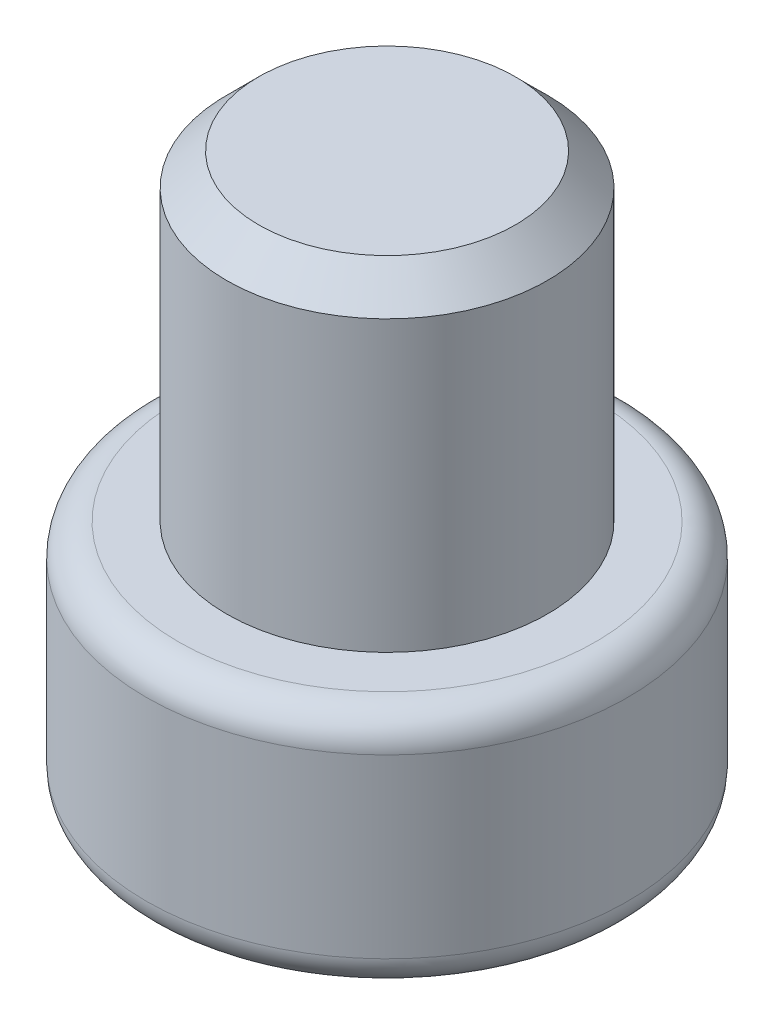
ISO-10303-21;
HEADER;
FILE_DESCRIPTION(('STEP AP214'),'2;1');
FILE_NAME('part.step','',(''),(''),'','','');
FILE_SCHEMA(('AUTOMOTIVE_DESIGN { 1 0 10303 214 1 1 1 1 }'));
ENDSEC;
DATA;
#1=APPLICATION_CONTEXT('core data for automotive mechanical design processes');
#2=APPLICATION_PROTOCOL_DEFINITION('international standard','automotive_design',2000,#1);
#3=PRODUCT_CONTEXT('',#1,'mechanical');
#4=PRODUCT('Part','Part','',(#3));
#5=PRODUCT_RELATED_PRODUCT_CATEGORY('part','',(#4));
#6=PRODUCT_DEFINITION_FORMATION('','',#4);
#7=PRODUCT_DEFINITION_CONTEXT('part definition',#1,'design');
#8=PRODUCT_DEFINITION('design','',#6,#7);
#9=PRODUCT_DEFINITION_SHAPE('','',#8);
#10=(LENGTH_UNIT() NAMED_UNIT(*) SI_UNIT(.MILLI.,.METRE.));
#11=(NAMED_UNIT(*) PLANE_ANGLE_UNIT() SI_UNIT($,.RADIAN.));
#12=(NAMED_UNIT(*) SI_UNIT($,.STERADIAN.) SOLID_ANGLE_UNIT());
#13=UNCERTAINTY_MEASURE_WITH_UNIT(LENGTH_MEASURE(1.E-05),#10,'distance_accuracy_value','');
#14=(GEOMETRIC_REPRESENTATION_CONTEXT(3) GLOBAL_UNCERTAINTY_ASSIGNED_CONTEXT((#13)) GLOBAL_UNIT_ASSIGNED_CONTEXT((#10,
#11,#12)) REPRESENTATION_CONTEXT('',''));
#15=CARTESIAN_POINT('',(0.,0.,0.));
#16=DIRECTION('',(0.,0.,1.));
#17=DIRECTION('',(1.,0.,0.));
#18=AXIS2_PLACEMENT_3D('',#15,#16,#17);
#19=CARTESIAN_POINT('',(0.,0.,0.));
#20=DIRECTION('',(0.,1.,0.));
#21=DIRECTION('',(0.,0.,1.));
#22=AXIS2_PLACEMENT_3D('',#19,#20,#21);
#23=PLANE('',#22);
#24=CARTESIAN_POINT('',(0.,0.,0.));
#25=DIRECTION('',(0.,1.,0.));
#26=DIRECTION('',(0.,0.,1.));
#27=AXIS2_PLACEMENT_3D('',#24,#25,#26);
#28=CIRCLE('',#27,13.);
#29=CARTESIAN_POINT('',(0.,0.,13.));
#30=VERTEX_POINT('',#29);
#31=EDGE_CURVE('E45',#30,#30,#28,.F.);
#32=ORIENTED_EDGE('',*,*,#31,.T.);
#33=EDGE_LOOP('',(#32));
#34=FACE_BOUND('',#33,.T.);
#35=CARTESIAN_POINT('',(0.,0.,0.));
#36=DIRECTION('',(0.,1.,0.));
#37=DIRECTION('',(0.,0.,1.));
#38=AXIS2_PLACEMENT_3D('',#35,#36,#37);
#39=CIRCLE('',#38,10.5);
#40=CARTESIAN_POINT('',(0.,0.,10.5));
#41=VERTEX_POINT('',#40);
#42=EDGE_CURVE('E65',#41,#41,#39,.T.);
#43=ORIENTED_EDGE('',*,*,#42,.T.);
#44=EDGE_LOOP('',(#43));
#45=FACE_BOUND('',#44,.T.);
#46=ADVANCED_FACE('F34',(#34,#45),#23,.F.);
#47=CARTESIAN_POINT('',(0.,10.,0.));
#48=DIRECTION('',(0.,-1.,0.));
#49=DIRECTION('',(0.,0.,-1.));
#50=AXIS2_PLACEMENT_3D('',#47,#48,#49);
#51=CYLINDRICAL_SURFACE('',#50,15.);
#52=CARTESIAN_POINT('',(0.,2.,0.));
#53=DIRECTION('',(0.,1.,0.));
#54=DIRECTION('',(0.,0.,1.));
#55=AXIS2_PLACEMENT_3D('',#52,#53,#54);
#56=CIRCLE('',#55,15.);
#57=CARTESIAN_POINT('',(0.,2.,15.));
#58=VERTEX_POINT('',#57);
#59=EDGE_CURVE('E46',#58,#58,#56,.T.);
#60=ORIENTED_EDGE('',*,*,#59,.T.);
#61=EDGE_LOOP('',(#60));
#62=FACE_BOUND('',#61,.T.);
#63=CARTESIAN_POINT('',(0.,13.,0.));
#64=DIRECTION('',(0.,1.,0.));
#65=DIRECTION('',(0.,0.,1.));
#66=AXIS2_PLACEMENT_3D('',#63,#64,#65);
#67=CIRCLE('',#66,15.);
#68=CARTESIAN_POINT('',(0.,13.,15.));
#69=VERTEX_POINT('',#68);
#70=EDGE_CURVE('E49',#69,#69,#67,.F.);
#71=ORIENTED_EDGE('',*,*,#70,.T.);
#72=EDGE_LOOP('',(#71));
#73=FACE_BOUND('',#72,.T.);
#74=ADVANCED_FACE('F89',(#62,#73),#51,.T.);
#75=CARTESIAN_POINT('',(0.,10.,0.));
#76=DIRECTION('',(0.,-1.,0.));
#77=DIRECTION('',(0.,0.,-1.));
#78=AXIS2_PLACEMENT_3D('',#75,#76,#77);
#79=CYLINDRICAL_SURFACE('',#78,10.5);
#80=CARTESIAN_POINT('',(0.,10.,0.));
#81=DIRECTION('',(0.,1.,0.));
#82=DIRECTION('',(0.,0.,1.));
#83=AXIS2_PLACEMENT_3D('',#80,#81,#82);
#84=CIRCLE('',#83,10.5);
#85=CARTESIAN_POINT('',(0.,10.,10.5));
#86=VERTEX_POINT('',#85);
#87=EDGE_CURVE('E64',#86,#86,#84,.T.);
#88=ORIENTED_EDGE('',*,*,#87,.T.);
#89=EDGE_LOOP('',(#88));
#90=FACE_BOUND('',#89,.T.);
#91=ORIENTED_EDGE('',*,*,#42,.F.);
#92=EDGE_LOOP('',(#91));
#93=FACE_BOUND('',#92,.T.);
#94=ADVANCED_FACE('F88',(#90,#93),#79,.F.);
#95=CARTESIAN_POINT('',(0.,10.,0.));
#96=DIRECTION('',(0.,1.,0.));
#97=DIRECTION('',(0.,0.,1.));
#98=AXIS2_PLACEMENT_3D('',#95,#96,#97);
#99=PLANE('',#98);
#100=ORIENTED_EDGE('',*,*,#87,.F.);
#101=EDGE_LOOP('',(#100));
#102=FACE_BOUND('',#101,.T.);
#103=ADVANCED_FACE('F73',(#102),#99,.F.);
#104=CARTESIAN_POINT('',(0.,15.,0.));
#105=DIRECTION('',(0.,1.,0.));
#106=DIRECTION('',(0.,0.,1.));
#107=AXIS2_PLACEMENT_3D('',#104,#105,#106);
#108=PLANE('',#107);
#109=CARTESIAN_POINT('',(0.,15.,0.));
#110=DIRECTION('',(0.,1.,0.));
#111=DIRECTION('',(0.,0.,1.));
#112=AXIS2_PLACEMENT_3D('',#109,#110,#111);
#113=CIRCLE('',#112,13.);
#114=CARTESIAN_POINT('',(0.,15.,13.));
#115=VERTEX_POINT('',#114);
#116=EDGE_CURVE('E10',#115,#115,#113,.T.);
#117=ORIENTED_EDGE('',*,*,#116,.T.);
#118=EDGE_LOOP('',(#117));
#119=FACE_BOUND('',#118,.T.);
#120=CARTESIAN_POINT('',(0.,15.,0.));
#121=DIRECTION('',(0.,1.,0.));
#122=DIRECTION('',(0.,0.,1.));
#123=AXIS2_PLACEMENT_3D('',#120,#121,#122);
#124=CIRCLE('',#123,10.);
#125=CARTESIAN_POINT('',(0.,15.,10.));
#126=VERTEX_POINT('',#125);
#127=EDGE_CURVE('E61',#126,#126,#124,.T.);
#128=ORIENTED_EDGE('',*,*,#127,.F.);
#129=EDGE_LOOP('',(#128));
#130=FACE_BOUND('',#129,.T.);
#131=ADVANCED_FACE('F71',(#119,#130),#108,.T.);
#132=CARTESIAN_POINT('',(0.,35.,0.));
#133=DIRECTION('',(0.,-1.,0.));
#134=DIRECTION('',(0.,0.,-1.));
#135=AXIS2_PLACEMENT_3D('',#132,#133,#134);
#136=CYLINDRICAL_SURFACE('',#135,10.);
#137=CARTESIAN_POINT('',(0.,33.,0.));
#138=DIRECTION('',(0.,1.,0.));
#139=DIRECTION('',(0.,0.,1.));
#140=AXIS2_PLACEMENT_3D('',#137,#138,#139);
#141=CIRCLE('',#140,10.);
#142=CARTESIAN_POINT('',(0.,33.,10.));
#143=VERTEX_POINT('',#142);
#144=EDGE_CURVE('E54',#143,#143,#141,.F.);
#145=ORIENTED_EDGE('',*,*,#144,.T.);
#146=EDGE_LOOP('',(#145));
#147=FACE_BOUND('',#146,.T.);
#148=ORIENTED_EDGE('',*,*,#127,.T.);
#149=EDGE_LOOP('',(#148));
#150=FACE_BOUND('',#149,.T.);
#151=ADVANCED_FACE('F72',(#147,#150),#136,.T.);
#152=CARTESIAN_POINT('',(0.,35.,0.));
#153=DIRECTION('',(0.,1.,0.));
#154=DIRECTION('',(0.,0.,1.));
#155=AXIS2_PLACEMENT_3D('',#152,#153,#154);
#156=PLANE('',#155);
#157=CARTESIAN_POINT('',(0.,35.,0.));
#158=DIRECTION('',(0.,1.,0.));
#159=DIRECTION('',(0.,0.,1.));
#160=AXIS2_PLACEMENT_3D('',#157,#158,#159);
#161=CIRCLE('',#160,7.99999999999999);
#162=CARTESIAN_POINT('',(0.,35.,7.99999999999999));
#163=VERTEX_POINT('',#162);
#164=EDGE_CURVE('E59',#163,#163,#161,.T.);
#165=ORIENTED_EDGE('',*,*,#164,.T.);
#166=EDGE_LOOP('',(#165));
#167=FACE_BOUND('',#166,.T.);
#168=ADVANCED_FACE('F84',(#167),#156,.T.);
#169=CARTESIAN_POINT('',(0.,35.,0.));
#170=DIRECTION('',(0.,-1.,0.));
#171=DIRECTION('',(0.,0.,-1.));
#172=AXIS2_PLACEMENT_3D('',#169,#170,#171);
#173=CONICAL_SURFACE('',#172,7.99999999999999,0.785398163397448);
#174=ORIENTED_EDGE('',*,*,#144,.F.);
#175=EDGE_LOOP('',(#174));
#176=FACE_BOUND('',#175,.T.);
#177=ORIENTED_EDGE('',*,*,#164,.F.);
#178=EDGE_LOOP('',(#177));
#179=FACE_BOUND('',#178,.T.);
#180=ADVANCED_FACE('F99',(#176,#179),#173,.T.);
#181=CARTESIAN_POINT('',(0.,2.,0.));
#182=DIRECTION('',(0.,1.,0.));
#183=DIRECTION('',(0.,0.,1.));
#184=AXIS2_PLACEMENT_3D('',#181,#182,#183);
#185=TOROIDAL_SURFACE('',#184,13.,2.);
#186=ORIENTED_EDGE('',*,*,#31,.F.);
#187=EDGE_LOOP('',(#186));
#188=FACE_BOUND('',#187,.T.);
#189=ORIENTED_EDGE('',*,*,#59,.F.);
#190=EDGE_LOOP('',(#189));
#191=FACE_BOUND('',#190,.T.);
#192=ADVANCED_FACE('F101',(#188,#191),#185,.T.);
#193=CARTESIAN_POINT('',(0.,13.,0.));
#194=DIRECTION('',(0.,1.,0.));
#195=DIRECTION('',(0.,0.,1.));
#196=AXIS2_PLACEMENT_3D('',#193,#194,#195);
#197=TOROIDAL_SURFACE('',#196,13.,2.);
#198=ORIENTED_EDGE('',*,*,#70,.F.);
#199=EDGE_LOOP('',(#198));
#200=FACE_BOUND('',#199,.T.);
#201=ORIENTED_EDGE('',*,*,#116,.F.);
#202=EDGE_LOOP('',(#201));
#203=FACE_BOUND('',#202,.T.);
#204=ADVANCED_FACE('F40',(#200,#203),#197,.T.);
#205=CLOSED_SHELL('',(#46,#74,#94,#103,#131,#151,#168,#180,#192,#204));
#206=MANIFOLD_SOLID_BREP('B2',#205);
#207=ADVANCED_BREP_SHAPE_REPRESENTATION('',(#18,#206),#14);
#208=SHAPE_DEFINITION_REPRESENTATION(#9,#207);
ENDSEC;
END-ISO-10303-21;
